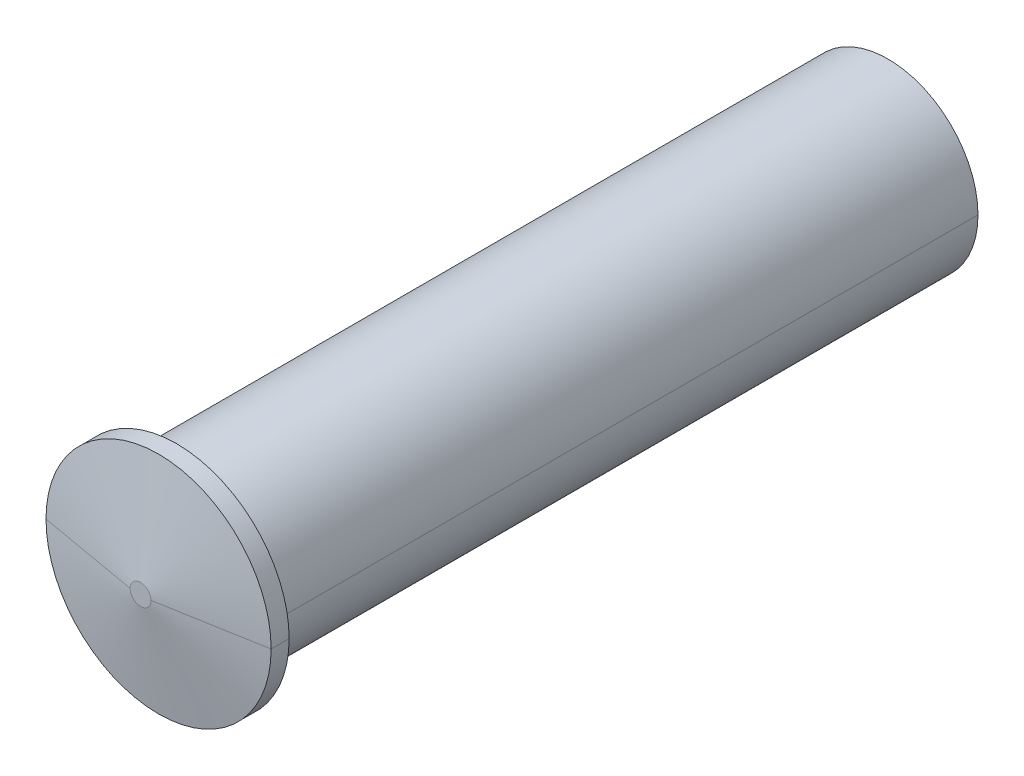
ISO-10303-21;
HEADER;
FILE_DESCRIPTION(('STEP AP214'),'2;1');
FILE_NAME('part.step','',(''),(''),'','','');
FILE_SCHEMA(('AUTOMOTIVE_DESIGN { 1 0 10303 214 1 1 1 1 }'));
ENDSEC;
DATA;
#1=APPLICATION_CONTEXT('core data for automotive mechanical design processes');
#2=APPLICATION_PROTOCOL_DEFINITION('international standard','automotive_design',2000,#1);
#3=PRODUCT_CONTEXT('',#1,'mechanical');
#4=PRODUCT('Part','Part','',(#3));
#5=PRODUCT_RELATED_PRODUCT_CATEGORY('part','',(#4));
#6=PRODUCT_DEFINITION_FORMATION('','',#4);
#7=PRODUCT_DEFINITION_CONTEXT('part definition',#1,'design');
#8=PRODUCT_DEFINITION('design','',#6,#7);
#9=PRODUCT_DEFINITION_SHAPE('','',#8);
#10=(LENGTH_UNIT() NAMED_UNIT(*) SI_UNIT(.MILLI.,.METRE.));
#11=(NAMED_UNIT(*) PLANE_ANGLE_UNIT() SI_UNIT($,.RADIAN.));
#12=(NAMED_UNIT(*) SI_UNIT($,.STERADIAN.) SOLID_ANGLE_UNIT());
#13=UNCERTAINTY_MEASURE_WITH_UNIT(LENGTH_MEASURE(1.E-05),#10,'distance_accuracy_value','');
#14=(GEOMETRIC_REPRESENTATION_CONTEXT(3) GLOBAL_UNCERTAINTY_ASSIGNED_CONTEXT((#13)) GLOBAL_UNIT_ASSIGNED_CONTEXT((#10,
#11,#12)) REPRESENTATION_CONTEXT('',''));
#15=CARTESIAN_POINT('',(0.,0.,0.));
#16=DIRECTION('',(0.,0.,1.));
#17=DIRECTION('',(1.,0.,0.));
#18=AXIS2_PLACEMENT_3D('',#15,#16,#17);
#19=CARTESIAN_POINT('',(0.,0.,0.));
#20=DIRECTION('',(0.,0.,-1.));
#21=DIRECTION('',(0.,-1.,0.));
#22=AXIS2_PLACEMENT_3D('',#19,#20,#21);
#23=PLANE('',#22);
#24=CARTESIAN_POINT('',(0.,0.,0.));
#25=DIRECTION('',(0.,0.,-1.));
#26=DIRECTION('',(-1.,0.,0.));
#27=AXIS2_PLACEMENT_3D('',#24,#25,#26);
#28=CIRCLE('',#27,8.);
#29=CARTESIAN_POINT('',(-8.,0.,0.));
#30=VERTEX_POINT('',#29);
#31=CARTESIAN_POINT('',(8.,0.,0.));
#32=VERTEX_POINT('',#31);
#33=EDGE_CURVE('E11',#30,#32,#28,.T.);
#34=ORIENTED_EDGE('',*,*,#33,.T.);
#35=CARTESIAN_POINT('',(0.,0.,0.));
#36=DIRECTION('',(0.,0.,-1.));
#37=DIRECTION('',(-1.,0.,0.));
#38=AXIS2_PLACEMENT_3D('',#35,#36,#37);
#39=CIRCLE('',#38,8.);
#40=EDGE_CURVE('E166',#32,#30,#39,.T.);
#41=ORIENTED_EDGE('',*,*,#40,.T.);
#42=EDGE_LOOP('',(#34,#41));
#43=FACE_BOUND('',#42,.T.);
#44=ADVANCED_FACE('F17',(#43),#23,.T.);
#45=CARTESIAN_POINT('',(0.,0.,0.));
#46=DIRECTION('',(0.,0.,-1.));
#47=DIRECTION('',(-1.,0.,0.));
#48=AXIS2_PLACEMENT_3D('',#45,#46,#47);
#49=CYLINDRICAL_SURFACE('',#48,8.);
#50=DIRECTION('',(0.,0.,-1.));
#51=VECTOR('',#50,1.);
#52=CARTESIAN_POINT('',(8.,0.,0.));
#53=LINE('',#52,#51);
#54=CARTESIAN_POINT('',(8.,0.,-79.));
#55=VERTEX_POINT('',#54);
#56=EDGE_CURVE('E170',#32,#55,#53,.T.);
#57=ORIENTED_EDGE('',*,*,#56,.F.);
#58=ORIENTED_EDGE('',*,*,#33,.F.);
#59=DIRECTION('',(0.,0.,-1.));
#60=VECTOR('',#59,1.);
#61=CARTESIAN_POINT('',(-8.,0.,0.));
#62=LINE('',#61,#60);
#63=CARTESIAN_POINT('',(-8.,0.,-79.));
#64=VERTEX_POINT('',#63);
#65=EDGE_CURVE('E133',#30,#64,#62,.T.);
#66=ORIENTED_EDGE('',*,*,#65,.T.);
#67=CARTESIAN_POINT('',(0.,0.,-79.));
#68=DIRECTION('',(0.,0.,-1.));
#69=DIRECTION('',(-1.,0.,0.));
#70=AXIS2_PLACEMENT_3D('',#67,#68,#69);
#71=CIRCLE('',#70,8.);
#72=EDGE_CURVE('E155',#64,#55,#71,.T.);
#73=ORIENTED_EDGE('',*,*,#72,.T.);
#74=EDGE_LOOP('',(#57,#58,#66,#73));
#75=FACE_BOUND('',#74,.T.);
#76=ADVANCED_FACE('F198',(#75),#49,.F.);
#77=CARTESIAN_POINT('',(0.,0.,4.));
#78=DIRECTION('',(0.,0.,1.));
#79=DIRECTION('',(1.,0.,0.));
#80=AXIS2_PLACEMENT_3D('',#77,#78,#79);
#81=PLANE('',#80);
#82=CARTESIAN_POINT('',(0.,0.,4.));
#83=DIRECTION('',(0.,0.,1.));
#84=DIRECTION('',(1.,0.,0.));
#85=AXIS2_PLACEMENT_3D('',#82,#83,#84);
#86=CIRCLE('',#85,1.15743636076438);
#87=CARTESIAN_POINT('',(1.15743636076438,0.,4.));
#88=VERTEX_POINT('',#87);
#89=CARTESIAN_POINT('',(-1.15743636076438,0.,4.));
#90=VERTEX_POINT('',#89);
#91=EDGE_CURVE('E21',#88,#90,#86,.T.);
#92=ORIENTED_EDGE('',*,*,#91,.T.);
#93=CARTESIAN_POINT('',(0.,0.,4.));
#94=DIRECTION('',(0.,0.,1.));
#95=DIRECTION('',(1.,0.,0.));
#96=AXIS2_PLACEMENT_3D('',#93,#94,#95);
#97=CIRCLE('',#96,1.15743636076438);
#98=EDGE_CURVE('E126',#90,#88,#97,.T.);
#99=ORIENTED_EDGE('',*,*,#98,.T.);
#100=EDGE_LOOP('',(#92,#99));
#101=FACE_BOUND('',#100,.T.);
#102=ADVANCED_FACE('F206',(#101),#81,.T.);
#103=CARTESIAN_POINT('',(0.,0.,2.));
#104=DIRECTION('',(0.,0.,-1.));
#105=DIRECTION('',(1.,0.,0.));
#106=AXIS2_PLACEMENT_3D('',#103,#104,#105);
#107=CONICAL_SURFACE('',#106,12.5,1.39626340159547);
#108=DIRECTION('',(-0.984807753012209,0.,-0.173648177666928));
#109=VECTOR('',#108,1.);
#110=CARTESIAN_POINT('',(-12.5,0.,2.));
#111=LINE('',#110,#109);
#112=CARTESIAN_POINT('',(-12.5,0.,2.));
#113=VERTEX_POINT('',#112);
#114=EDGE_CURVE('E113',#90,#113,#111,.T.);
#115=ORIENTED_EDGE('',*,*,#114,.F.);
#116=ORIENTED_EDGE('',*,*,#91,.F.);
#117=DIRECTION('',(0.984807753012209,0.,-0.173648177666928));
#118=VECTOR('',#117,1.);
#119=CARTESIAN_POINT('',(12.5,0.,2.));
#120=LINE('',#119,#118);
#121=CARTESIAN_POINT('',(12.5,0.,2.));
#122=VERTEX_POINT('',#121);
#123=EDGE_CURVE('E115',#88,#122,#120,.T.);
#124=ORIENTED_EDGE('',*,*,#123,.T.);
#125=CARTESIAN_POINT('',(0.,0.,2.));
#126=DIRECTION('',(0.,0.,1.));
#127=DIRECTION('',(1.,0.,0.));
#128=AXIS2_PLACEMENT_3D('',#125,#126,#127);
#129=CIRCLE('',#128,12.5);
#130=EDGE_CURVE('E103',#122,#113,#129,.T.);
#131=ORIENTED_EDGE('',*,*,#130,.T.);
#132=EDGE_LOOP('',(#115,#116,#124,#131));
#133=FACE_BOUND('',#132,.T.);
#134=ADVANCED_FACE('F111',(#133),#107,.T.);
#135=CARTESIAN_POINT('',(0.,0.,0.));
#136=DIRECTION('',(0.,0.,1.));
#137=DIRECTION('',(1.,0.,0.));
#138=AXIS2_PLACEMENT_3D('',#135,#136,#137);
#139=PLANE('',#138);
#140=CARTESIAN_POINT('',(0.,0.,0.));
#141=DIRECTION('',(0.,0.,1.));
#142=DIRECTION('',(1.,0.,0.));
#143=AXIS2_PLACEMENT_3D('',#140,#141,#142);
#144=CIRCLE('',#143,10.);
#145=CARTESIAN_POINT('',(10.,0.,0.));
#146=VERTEX_POINT('',#145);
#147=CARTESIAN_POINT('',(-10.,0.,0.));
#148=VERTEX_POINT('',#147);
#149=EDGE_CURVE('E140',#146,#148,#144,.T.);
#150=ORIENTED_EDGE('',*,*,#149,.T.);
#151=CARTESIAN_POINT('',(0.,0.,0.));
#152=DIRECTION('',(0.,0.,1.));
#153=DIRECTION('',(1.,0.,0.));
#154=AXIS2_PLACEMENT_3D('',#151,#152,#153);
#155=CIRCLE('',#154,10.);
#156=EDGE_CURVE('E41',#148,#146,#155,.T.);
#157=ORIENTED_EDGE('',*,*,#156,.T.);
#158=EDGE_LOOP('',(#150,#157));
#159=FACE_BOUND('',#158,.T.);
#160=CARTESIAN_POINT('',(0.,0.,0.));
#161=DIRECTION('',(0.,0.,1.));
#162=DIRECTION('',(1.,0.,0.));
#163=AXIS2_PLACEMENT_3D('',#160,#161,#162);
#164=CIRCLE('',#163,12.5);
#165=CARTESIAN_POINT('',(-12.5,0.,0.));
#166=VERTEX_POINT('',#165);
#167=CARTESIAN_POINT('',(12.5,0.,0.));
#168=VERTEX_POINT('',#167);
#169=EDGE_CURVE('E161',#166,#168,#164,.T.);
#170=ORIENTED_EDGE('',*,*,#169,.F.);
#171=CARTESIAN_POINT('',(0.,0.,0.));
#172=DIRECTION('',(0.,0.,1.));
#173=DIRECTION('',(1.,0.,0.));
#174=AXIS2_PLACEMENT_3D('',#171,#172,#173);
#175=CIRCLE('',#174,12.5);
#176=EDGE_CURVE('E105',#168,#166,#175,.T.);
#177=ORIENTED_EDGE('',*,*,#176,.F.);
#178=EDGE_LOOP('',(#170,#177));
#179=FACE_BOUND('',#178,.T.);
#180=ADVANCED_FACE('F217',(#159,#179),#139,.F.);
#181=CARTESIAN_POINT('',(0.,0.,2.));
#182=DIRECTION('',(0.,0.,-1.));
#183=DIRECTION('',(-1.,0.,0.));
#184=AXIS2_PLACEMENT_3D('',#181,#182,#183);
#185=CYLINDRICAL_SURFACE('',#184,12.5);
#186=DIRECTION('',(0.,0.,-1.));
#187=VECTOR('',#186,1.);
#188=CARTESIAN_POINT('',(12.5,0.,2.));
#189=LINE('',#188,#187);
#190=EDGE_CURVE('E118',#122,#168,#189,.T.);
#191=ORIENTED_EDGE('',*,*,#190,.F.);
#192=CARTESIAN_POINT('',(0.,0.,2.));
#193=DIRECTION('',(0.,0.,1.));
#194=DIRECTION('',(1.,0.,0.));
#195=AXIS2_PLACEMENT_3D('',#192,#193,#194);
#196=CIRCLE('',#195,12.5);
#197=EDGE_CURVE('E120',#113,#122,#196,.T.);
#198=ORIENTED_EDGE('',*,*,#197,.F.);
#199=DIRECTION('',(0.,0.,-1.));
#200=VECTOR('',#199,1.);
#201=CARTESIAN_POINT('',(-12.5,0.,2.));
#202=LINE('',#201,#200);
#203=EDGE_CURVE('E99',#113,#166,#202,.T.);
#204=ORIENTED_EDGE('',*,*,#203,.T.);
#205=ORIENTED_EDGE('',*,*,#169,.T.);
#206=EDGE_LOOP('',(#191,#198,#204,#205));
#207=FACE_BOUND('',#206,.T.);
#208=ADVANCED_FACE('F19',(#207),#185,.T.);
#209=CARTESIAN_POINT('',(0.,0.,-79.));
#210=DIRECTION('',(0.,0.,1.));
#211=DIRECTION('',(1.,0.,0.));
#212=AXIS2_PLACEMENT_3D('',#209,#210,#211);
#213=PLANE('',#212);
#214=ORIENTED_EDGE('',*,*,#72,.F.);
#215=CARTESIAN_POINT('',(0.,0.,-79.));
#216=DIRECTION('',(0.,0.,-1.));
#217=DIRECTION('',(-1.,0.,0.));
#218=AXIS2_PLACEMENT_3D('',#215,#216,#217);
#219=CIRCLE('',#218,8.);
#220=EDGE_CURVE('E177',#55,#64,#219,.T.);
#221=ORIENTED_EDGE('',*,*,#220,.F.);
#222=EDGE_LOOP('',(#214,#221));
#223=FACE_BOUND('',#222,.T.);
#224=CARTESIAN_POINT('',(0.,0.,-79.));
#225=DIRECTION('',(0.,0.,1.));
#226=DIRECTION('',(1.,0.,0.));
#227=AXIS2_PLACEMENT_3D('',#224,#225,#226);
#228=CIRCLE('',#227,10.);
#229=CARTESIAN_POINT('',(10.,0.,-79.));
#230=VERTEX_POINT('',#229);
#231=CARTESIAN_POINT('',(-10.,0.,-79.));
#232=VERTEX_POINT('',#231);
#233=EDGE_CURVE('E109',#230,#232,#228,.T.);
#234=ORIENTED_EDGE('',*,*,#233,.F.);
#235=CARTESIAN_POINT('',(0.,0.,-79.));
#236=DIRECTION('',(0.,0.,1.));
#237=DIRECTION('',(1.,0.,0.));
#238=AXIS2_PLACEMENT_3D('',#235,#236,#237);
#239=CIRCLE('',#238,10.);
#240=EDGE_CURVE('E139',#232,#230,#239,.T.);
#241=ORIENTED_EDGE('',*,*,#240,.F.);
#242=EDGE_LOOP('',(#234,#241));
#243=FACE_BOUND('',#242,.T.);
#244=ADVANCED_FACE('F195',(#223,#243),#213,.F.);
#245=CARTESIAN_POINT('',(0.,0.,-79.));
#246=DIRECTION('',(0.,0.,1.));
#247=DIRECTION('',(1.,0.,0.));
#248=AXIS2_PLACEMENT_3D('',#245,#246,#247);
#249=CYLINDRICAL_SURFACE('',#248,10.);
#250=DIRECTION('',(0.,0.,1.));
#251=VECTOR('',#250,1.);
#252=CARTESIAN_POINT('',(-10.,0.,-79.));
#253=LINE('',#252,#251);
#254=EDGE_CURVE('E145',#232,#148,#253,.T.);
#255=ORIENTED_EDGE('',*,*,#254,.F.);
#256=ORIENTED_EDGE('',*,*,#240,.T.);
#257=DIRECTION('',(0.,0.,1.));
#258=VECTOR('',#257,1.);
#259=CARTESIAN_POINT('',(10.,0.,-79.));
#260=LINE('',#259,#258);
#261=EDGE_CURVE('E137',#230,#146,#260,.T.);
#262=ORIENTED_EDGE('',*,*,#261,.T.);
#263=ORIENTED_EDGE('',*,*,#156,.F.);
#264=EDGE_LOOP('',(#255,#256,#262,#263));
#265=FACE_BOUND('',#264,.T.);
#266=ADVANCED_FACE('F211',(#265),#249,.T.);
#267=CARTESIAN_POINT('',(0.,0.,-79.));
#268=DIRECTION('',(0.,0.,1.));
#269=DIRECTION('',(1.,0.,0.));
#270=AXIS2_PLACEMENT_3D('',#267,#268,#269);
#271=CYLINDRICAL_SURFACE('',#270,10.);
#272=ORIENTED_EDGE('',*,*,#233,.T.);
#273=ORIENTED_EDGE('',*,*,#254,.T.);
#274=ORIENTED_EDGE('',*,*,#149,.F.);
#275=ORIENTED_EDGE('',*,*,#261,.F.);
#276=EDGE_LOOP('',(#272,#273,#274,#275));
#277=FACE_BOUND('',#276,.T.);
#278=ADVANCED_FACE('F218',(#277),#271,.T.);
#279=CARTESIAN_POINT('',(0.,0.,2.));
#280=DIRECTION('',(0.,0.,-1.));
#281=DIRECTION('',(-1.,0.,0.));
#282=AXIS2_PLACEMENT_3D('',#279,#280,#281);
#283=CYLINDRICAL_SURFACE('',#282,12.5);
#284=ORIENTED_EDGE('',*,*,#130,.F.);
#285=ORIENTED_EDGE('',*,*,#190,.T.);
#286=ORIENTED_EDGE('',*,*,#176,.T.);
#287=ORIENTED_EDGE('',*,*,#203,.F.);
#288=EDGE_LOOP('',(#284,#285,#286,#287));
#289=FACE_BOUND('',#288,.T.);
#290=ADVANCED_FACE('F101',(#289),#283,.T.);
#291=CARTESIAN_POINT('',(0.,0.,2.));
#292=DIRECTION('',(0.,0.,-1.));
#293=DIRECTION('',(1.,0.,0.));
#294=AXIS2_PLACEMENT_3D('',#291,#292,#293);
#295=CONICAL_SURFACE('',#294,12.5,1.39626340159547);
#296=ORIENTED_EDGE('',*,*,#98,.F.);
#297=ORIENTED_EDGE('',*,*,#114,.T.);
#298=ORIENTED_EDGE('',*,*,#197,.T.);
#299=ORIENTED_EDGE('',*,*,#123,.F.);
#300=EDGE_LOOP('',(#296,#297,#298,#299));
#301=FACE_BOUND('',#300,.T.);
#302=ADVANCED_FACE('F124',(#301),#295,.T.);
#303=CARTESIAN_POINT('',(0.,0.,0.));
#304=DIRECTION('',(0.,0.,-1.));
#305=DIRECTION('',(-1.,0.,0.));
#306=AXIS2_PLACEMENT_3D('',#303,#304,#305);
#307=CYLINDRICAL_SURFACE('',#306,8.);
#308=ORIENTED_EDGE('',*,*,#40,.F.);
#309=ORIENTED_EDGE('',*,*,#56,.T.);
#310=ORIENTED_EDGE('',*,*,#220,.T.);
#311=ORIENTED_EDGE('',*,*,#65,.F.);
#312=EDGE_LOOP('',(#308,#309,#310,#311));
#313=FACE_BOUND('',#312,.T.);
#314=ADVANCED_FACE('F192',(#313),#307,.F.);
#315=CLOSED_SHELL('',(#44,#76,#102,#134,#180,#208,#244,#266,#278,#290,#302,#314));
#316=MANIFOLD_SOLID_BREP('B1',#315);
#317=ADVANCED_BREP_SHAPE_REPRESENTATION('',(#18,#316),#14);
#318=SHAPE_DEFINITION_REPRESENTATION(#9,#317);
ENDSEC;
END-ISO-10303-21;
